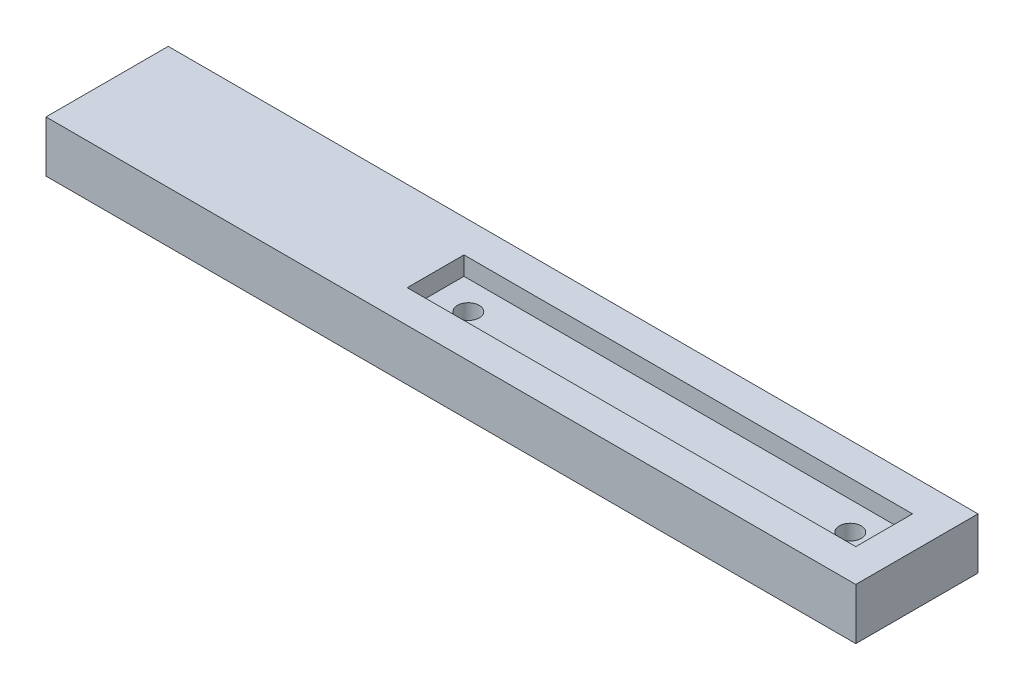
ISO-10303-21;
HEADER;
FILE_DESCRIPTION(('STEP AP214'),'2;1');
FILE_NAME('part.step','',(''),(''),'','','');
FILE_SCHEMA(('AUTOMOTIVE_DESIGN { 1 0 10303 214 1 1 1 1 }'));
ENDSEC;
DATA;
#1=APPLICATION_CONTEXT('core data for automotive mechanical design processes');
#2=APPLICATION_PROTOCOL_DEFINITION('international standard','automotive_design',2000,#1);
#3=PRODUCT_CONTEXT('',#1,'mechanical');
#4=PRODUCT('Part','Part','',(#3));
#5=PRODUCT_RELATED_PRODUCT_CATEGORY('part','',(#4));
#6=PRODUCT_DEFINITION_FORMATION('','',#4);
#7=PRODUCT_DEFINITION_CONTEXT('part definition',#1,'design');
#8=PRODUCT_DEFINITION('design','',#6,#7);
#9=PRODUCT_DEFINITION_SHAPE('','',#8);
#10=(LENGTH_UNIT() NAMED_UNIT(*) SI_UNIT(.MILLI.,.METRE.));
#11=(NAMED_UNIT(*) PLANE_ANGLE_UNIT() SI_UNIT($,.RADIAN.));
#12=(NAMED_UNIT(*) SI_UNIT($,.STERADIAN.) SOLID_ANGLE_UNIT());
#13=UNCERTAINTY_MEASURE_WITH_UNIT(LENGTH_MEASURE(1.E-05),#10,'distance_accuracy_value','');
#14=(GEOMETRIC_REPRESENTATION_CONTEXT(3) GLOBAL_UNCERTAINTY_ASSIGNED_CONTEXT((#13)) GLOBAL_UNIT_ASSIGNED_CONTEXT((#10,
#11,#12)) REPRESENTATION_CONTEXT('',''));
#15=CARTESIAN_POINT('',(0.,0.,0.));
#16=DIRECTION('',(0.,0.,1.));
#17=DIRECTION('',(1.,0.,0.));
#18=AXIS2_PLACEMENT_3D('',#15,#16,#17);
#19=CARTESIAN_POINT('',(-34.1,-1.7,2.6));
#20=DIRECTION('',(0.,0.,1.));
#21=DIRECTION('',(1.,0.,0.));
#22=AXIS2_PLACEMENT_3D('',#19,#20,#21);
#23=PLANE('',#22);
#24=DIRECTION('',(0.,-1.,0.));
#25=VECTOR('',#24,1.);
#26=CARTESIAN_POINT('',(-7.,27.5943834864996,2.6));
#27=LINE('',#26,#25);
#28=CARTESIAN_POINT('',(-7.,0.,2.6));
#29=VERTEX_POINT('',#28);
#30=CARTESIAN_POINT('',(-7.,-1.7,2.6));
#31=VERTEX_POINT('',#30);
#32=EDGE_CURVE('E65',#29,#31,#27,.T.);
#33=ORIENTED_EDGE('',*,*,#32,.F.);
#34=DIRECTION('',(1.,0.,0.));
#35=VECTOR('',#34,1.);
#36=CARTESIAN_POINT('',(-34.1,0.,2.6));
#37=LINE('',#36,#35);
#38=CARTESIAN_POINT('',(34.1,0.,2.6));
#39=VERTEX_POINT('',#38);
#40=EDGE_CURVE('E373',#29,#39,#37,.T.);
#41=ORIENTED_EDGE('',*,*,#40,.T.);
#42=DIRECTION('',(0.,1.,0.));
#43=VECTOR('',#42,1.);
#44=CARTESIAN_POINT('',(34.1,-1.7,2.6));
#45=LINE('',#44,#43);
#46=CARTESIAN_POINT('',(34.1,-1.7,2.6));
#47=VERTEX_POINT('',#46);
#48=EDGE_CURVE('E384',#47,#39,#45,.T.);
#49=ORIENTED_EDGE('',*,*,#48,.F.);
#50=DIRECTION('',(1.,0.,0.));
#51=VECTOR('',#50,1.);
#52=CARTESIAN_POINT('',(-34.1,-1.7,2.6));
#53=LINE('',#52,#51);
#54=EDGE_CURVE('E196',#31,#47,#53,.T.);
#55=ORIENTED_EDGE('',*,*,#54,.F.);
#56=EDGE_LOOP('',(#33,#41,#49,#55));
#57=FACE_BOUND('',#56,.T.);
#58=ADVANCED_FACE('F47',(#57),#23,.F.);
#59=CARTESIAN_POINT('',(-34.1,-1.7,-2.6));
#60=DIRECTION('',(0.,0.,-1.));
#61=DIRECTION('',(-1.,0.,0.));
#62=AXIS2_PLACEMENT_3D('',#59,#60,#61);
#63=PLANE('',#62);
#64=DIRECTION('',(0.,-1.,0.));
#65=VECTOR('',#64,1.);
#66=CARTESIAN_POINT('',(-7.,27.5943834864996,-2.6));
#67=LINE('',#66,#65);
#68=CARTESIAN_POINT('',(-7.,0.,-2.6));
#69=VERTEX_POINT('',#68);
#70=CARTESIAN_POINT('',(-7.,-1.7,-2.6));
#71=VERTEX_POINT('',#70);
#72=EDGE_CURVE('E198',#69,#71,#67,.T.);
#73=ORIENTED_EDGE('',*,*,#72,.T.);
#74=DIRECTION('',(-1.,0.,0.));
#75=VECTOR('',#74,1.);
#76=CARTESIAN_POINT('',(-34.1,-1.7,-2.6));
#77=LINE('',#76,#75);
#78=CARTESIAN_POINT('',(34.1,-1.7,-2.6));
#79=VERTEX_POINT('',#78);
#80=EDGE_CURVE('E189',#79,#71,#77,.T.);
#81=ORIENTED_EDGE('',*,*,#80,.F.);
#82=DIRECTION('',(0.,1.,0.));
#83=VECTOR('',#82,1.);
#84=CARTESIAN_POINT('',(34.1,-1.7,-2.6));
#85=LINE('',#84,#83);
#86=CARTESIAN_POINT('',(34.1,0.,-2.6));
#87=VERTEX_POINT('',#86);
#88=EDGE_CURVE('E377',#79,#87,#85,.T.);
#89=ORIENTED_EDGE('',*,*,#88,.T.);
#90=DIRECTION('',(-1.,0.,0.));
#91=VECTOR('',#90,1.);
#92=CARTESIAN_POINT('',(-34.1,0.,-2.6));
#93=LINE('',#92,#91);
#94=EDGE_CURVE('E73',#87,#69,#93,.T.);
#95=ORIENTED_EDGE('',*,*,#94,.T.);
#96=EDGE_LOOP('',(#73,#81,#89,#95));
#97=FACE_BOUND('',#96,.T.);
#98=ADVANCED_FACE('F199',(#97),#63,.F.);
#99=CARTESIAN_POINT('',(0.,-1.7,0.));
#100=DIRECTION('',(0.,-1.,0.));
#101=DIRECTION('',(0.,0.,-1.));
#102=AXIS2_PLACEMENT_3D('',#99,#100,#101);
#103=PLANE('',#102);
#104=CARTESIAN_POINT('',(31.,-1.7,0.));
#105=DIRECTION('',(0.,1.,0.));
#106=DIRECTION('',(0.,0.,1.));
#107=AXIS2_PLACEMENT_3D('',#104,#105,#106);
#108=CIRCLE('',#107,0.999999999999995);
#109=CARTESIAN_POINT('',(31.,-1.7,0.999999999999995));
#110=VERTEX_POINT('',#109);
#111=EDGE_CURVE('E352',#110,#110,#108,.T.);
#112=ORIENTED_EDGE('',*,*,#111,.F.);
#113=EDGE_LOOP('',(#112));
#114=FACE_BOUND('',#113,.T.);
#115=CARTESIAN_POINT('',(-4.,-1.7,0.));
#116=DIRECTION('',(0.,1.,0.));
#117=DIRECTION('',(0.,0.,1.));
#118=AXIS2_PLACEMENT_3D('',#115,#116,#117);
#119=CIRCLE('',#118,1.);
#120=CARTESIAN_POINT('',(-4.,-1.7,1.));
#121=VERTEX_POINT('',#120);
#122=EDGE_CURVE('E347',#121,#121,#119,.T.);
#123=ORIENTED_EDGE('',*,*,#122,.F.);
#124=EDGE_LOOP('',(#123));
#125=FACE_BOUND('',#124,.T.);
#126=DIRECTION('',(0.,0.,-1.));
#127=VECTOR('',#126,1.);
#128=CARTESIAN_POINT('',(-7.,-1.7,-2.6));
#129=LINE('',#128,#127);
#130=EDGE_CURVE('E192',#31,#71,#129,.T.);
#131=ORIENTED_EDGE('',*,*,#130,.F.);
#132=ORIENTED_EDGE('',*,*,#54,.T.);
#133=DIRECTION('',(0.,0.,-1.));
#134=VECTOR('',#133,1.);
#135=CARTESIAN_POINT('',(34.1,-1.7,-2.6));
#136=LINE('',#135,#134);
#137=EDGE_CURVE('E194',#47,#79,#136,.T.);
#138=ORIENTED_EDGE('',*,*,#137,.T.);
#139=ORIENTED_EDGE('',*,*,#80,.T.);
#140=EDGE_LOOP('',(#131,#132,#138,#139));
#141=FACE_BOUND('',#140,.T.);
#142=ADVANCED_FACE('F190',(#114,#125,#141),#103,.F.);
#143=CARTESIAN_POINT('',(31.,-7.5284271247462,0.));
#144=DIRECTION('',(0.,1.,0.));
#145=DIRECTION('',(0.,0.,1.));
#146=AXIS2_PLACEMENT_3D('',#143,#144,#145);
#147=CYLINDRICAL_SURFACE('',#146,0.999999999999995);
#148=ORIENTED_EDGE('',*,*,#111,.T.);
#149=EDGE_LOOP('',(#148));
#150=FACE_BOUND('',#149,.T.);
#151=CARTESIAN_POINT('',(31.,-3.1,0.));
#152=DIRECTION('',(0.,-1.,0.));
#153=DIRECTION('',(0.,0.,-1.));
#154=AXIS2_PLACEMENT_3D('',#151,#152,#153);
#155=CIRCLE('',#154,0.999999999999995);
#156=CARTESIAN_POINT('',(31.,-3.1,-0.999999999999995));
#157=VERTEX_POINT('',#156);
#158=EDGE_CURVE('E51',#157,#157,#155,.F.);
#159=ORIENTED_EDGE('',*,*,#158,.F.);
#160=EDGE_LOOP('',(#159));
#161=FACE_BOUND('',#160,.T.);
#162=ADVANCED_FACE('F423',(#150,#161),#147,.F.);
#163=CARTESIAN_POINT('',(-4.,-7.5284271247462,0.));
#164=DIRECTION('',(0.,1.,0.));
#165=DIRECTION('',(0.,0.,1.));
#166=AXIS2_PLACEMENT_3D('',#163,#164,#165);
#167=CYLINDRICAL_SURFACE('',#166,1.);
#168=ORIENTED_EDGE('',*,*,#122,.T.);
#169=EDGE_LOOP('',(#168));
#170=FACE_BOUND('',#169,.T.);
#171=CARTESIAN_POINT('',(-4.,-3.1,0.));
#172=DIRECTION('',(0.,-1.,0.));
#173=DIRECTION('',(0.,0.,-1.));
#174=AXIS2_PLACEMENT_3D('',#171,#172,#173);
#175=CIRCLE('',#174,1.);
#176=CARTESIAN_POINT('',(-4.,-3.1,-1.));
#177=VERTEX_POINT('',#176);
#178=EDGE_CURVE('E267',#177,#177,#175,.F.);
#179=ORIENTED_EDGE('',*,*,#178,.F.);
#180=EDGE_LOOP('',(#179));
#181=FACE_BOUND('',#180,.T.);
#182=ADVANCED_FACE('F425',(#170,#181),#167,.F.);
#183=CARTESIAN_POINT('',(-37.1,-1.7,-5.6));
#184=DIRECTION('',(-1.,0.,0.));
#185=DIRECTION('',(0.,0.,1.));
#186=AXIS2_PLACEMENT_3D('',#183,#184,#185);
#187=PLANE('',#186);
#188=DIRECTION('',(0.,0.,1.));
#189=VECTOR('',#188,1.);
#190=CARTESIAN_POINT('',(-37.1,0.,-5.6));
#191=LINE('',#190,#189);
#192=CARTESIAN_POINT('',(-37.1,0.,-5.6));
#193=VERTEX_POINT('',#192);
#194=CARTESIAN_POINT('',(-37.1,0.,5.6));
#195=VERTEX_POINT('',#194);
#196=EDGE_CURVE('E388',#193,#195,#191,.T.);
#197=ORIENTED_EDGE('',*,*,#196,.F.);
#198=DIRECTION('',(0.,1.,0.));
#199=VECTOR('',#198,1.);
#200=CARTESIAN_POINT('',(-37.1,-1.7,-5.6));
#201=LINE('',#200,#199);
#202=CARTESIAN_POINT('',(-37.1,-4.7,-5.6));
#203=VERTEX_POINT('',#202);
#204=EDGE_CURVE('E11',#203,#193,#201,.T.);
#205=ORIENTED_EDGE('',*,*,#204,.F.);
#206=DIRECTION('',(0.,0.,-1.));
#207=VECTOR('',#206,1.);
#208=CARTESIAN_POINT('',(-37.1,-4.7,5.6));
#209=LINE('',#208,#207);
#210=CARTESIAN_POINT('',(-37.1,-4.7,5.6));
#211=VERTEX_POINT('',#210);
#212=EDGE_CURVE('E359',#211,#203,#209,.T.);
#213=ORIENTED_EDGE('',*,*,#212,.F.);
#214=DIRECTION('',(0.,1.,0.));
#215=VECTOR('',#214,1.);
#216=CARTESIAN_POINT('',(-37.1,-1.7,5.6));
#217=LINE('',#216,#215);
#218=EDGE_CURVE('E405',#211,#195,#217,.T.);
#219=ORIENTED_EDGE('',*,*,#218,.T.);
#220=EDGE_LOOP('',(#197,#205,#213,#219));
#221=FACE_BOUND('',#220,.T.);
#222=ADVANCED_FACE('F49',(#221),#187,.T.);
#223=CARTESIAN_POINT('',(-37.1,-1.7,-5.6));
#224=DIRECTION('',(0.,0.,-1.));
#225=DIRECTION('',(-1.,0.,0.));
#226=AXIS2_PLACEMENT_3D('',#223,#224,#225);
#227=PLANE('',#226);
#228=DIRECTION('',(-1.,0.,0.));
#229=VECTOR('',#228,1.);
#230=CARTESIAN_POINT('',(-37.1,0.,-5.6));
#231=LINE('',#230,#229);
#232=CARTESIAN_POINT('',(37.1,0.,-5.6));
#233=VERTEX_POINT('',#232);
#234=EDGE_CURVE('E402',#233,#193,#231,.T.);
#235=ORIENTED_EDGE('',*,*,#234,.F.);
#236=DIRECTION('',(0.,1.,0.));
#237=VECTOR('',#236,1.);
#238=CARTESIAN_POINT('',(37.1,-1.7,-5.6));
#239=LINE('',#238,#237);
#240=CARTESIAN_POINT('',(37.1,-4.7,-5.6));
#241=VERTEX_POINT('',#240);
#242=EDGE_CURVE('E57',#241,#233,#239,.T.);
#243=ORIENTED_EDGE('',*,*,#242,.F.);
#244=DIRECTION('',(1.,0.,0.));
#245=VECTOR('',#244,1.);
#246=CARTESIAN_POINT('',(-37.1,-4.7,-5.6));
#247=LINE('',#246,#245);
#248=EDGE_CURVE('E363',#203,#241,#247,.T.);
#249=ORIENTED_EDGE('',*,*,#248,.F.);
#250=ORIENTED_EDGE('',*,*,#204,.T.);
#251=EDGE_LOOP('',(#235,#243,#249,#250));
#252=FACE_BOUND('',#251,.T.);
#253=ADVANCED_FACE('F455',(#252),#227,.T.);
#254=CARTESIAN_POINT('',(37.1,-1.7,-5.6));
#255=DIRECTION('',(1.,0.,0.));
#256=DIRECTION('',(0.,0.,-1.));
#257=AXIS2_PLACEMENT_3D('',#254,#255,#256);
#258=PLANE('',#257);
#259=DIRECTION('',(0.,0.,-1.));
#260=VECTOR('',#259,1.);
#261=CARTESIAN_POINT('',(37.1,0.,-5.6));
#262=LINE('',#261,#260);
#263=CARTESIAN_POINT('',(37.1,0.,5.6));
#264=VERTEX_POINT('',#263);
#265=EDGE_CURVE('E398',#264,#233,#262,.T.);
#266=ORIENTED_EDGE('',*,*,#265,.F.);
#267=DIRECTION('',(0.,1.,0.));
#268=VECTOR('',#267,1.);
#269=CARTESIAN_POINT('',(37.1,-1.7,5.6));
#270=LINE('',#269,#268);
#271=CARTESIAN_POINT('',(37.1,-4.7,5.6));
#272=VERTEX_POINT('',#271);
#273=EDGE_CURVE('E409',#272,#264,#270,.T.);
#274=ORIENTED_EDGE('',*,*,#273,.F.);
#275=DIRECTION('',(0.,0.,1.));
#276=VECTOR('',#275,1.);
#277=CARTESIAN_POINT('',(37.1,-4.7,-5.6));
#278=LINE('',#277,#276);
#279=EDGE_CURVE('E367',#241,#272,#278,.T.);
#280=ORIENTED_EDGE('',*,*,#279,.F.);
#281=ORIENTED_EDGE('',*,*,#242,.T.);
#282=EDGE_LOOP('',(#266,#274,#280,#281));
#283=FACE_BOUND('',#282,.T.);
#284=ADVANCED_FACE('F458',(#283),#258,.T.);
#285=CARTESIAN_POINT('',(-37.1,-1.7,5.6));
#286=DIRECTION('',(0.,0.,1.));
#287=DIRECTION('',(1.,0.,0.));
#288=AXIS2_PLACEMENT_3D('',#285,#286,#287);
#289=PLANE('',#288);
#290=DIRECTION('',(1.,0.,0.));
#291=VECTOR('',#290,1.);
#292=CARTESIAN_POINT('',(-37.1,0.,5.6));
#293=LINE('',#292,#291);
#294=EDGE_CURVE('E394',#195,#264,#293,.T.);
#295=ORIENTED_EDGE('',*,*,#294,.F.);
#296=ORIENTED_EDGE('',*,*,#218,.F.);
#297=DIRECTION('',(-1.,0.,0.));
#298=VECTOR('',#297,1.);
#299=CARTESIAN_POINT('',(37.1,-4.7,5.6));
#300=LINE('',#299,#298);
#301=EDGE_CURVE('E351',#272,#211,#300,.T.);
#302=ORIENTED_EDGE('',*,*,#301,.F.);
#303=ORIENTED_EDGE('',*,*,#273,.T.);
#304=EDGE_LOOP('',(#295,#296,#302,#303));
#305=FACE_BOUND('',#304,.T.);
#306=ADVANCED_FACE('F453',(#305),#289,.T.);
#307=CARTESIAN_POINT('',(0.,0.,0.));
#308=DIRECTION('',(0.,1.,0.));
#309=DIRECTION('',(0.,0.,1.));
#310=AXIS2_PLACEMENT_3D('',#307,#308,#309);
#311=PLANE('',#310);
#312=ORIENTED_EDGE('',*,*,#40,.F.);
#313=DIRECTION('',(0.,0.,-1.));
#314=VECTOR('',#313,1.);
#315=CARTESIAN_POINT('',(-7.,0.,-2.6));
#316=LINE('',#315,#314);
#317=EDGE_CURVE('E207',#29,#69,#316,.T.);
#318=ORIENTED_EDGE('',*,*,#317,.T.);
#319=ORIENTED_EDGE('',*,*,#94,.F.);
#320=DIRECTION('',(0.,0.,-1.));
#321=VECTOR('',#320,1.);
#322=CARTESIAN_POINT('',(34.1,0.,-2.6));
#323=LINE('',#322,#321);
#324=EDGE_CURVE('E371',#39,#87,#323,.T.);
#325=ORIENTED_EDGE('',*,*,#324,.F.);
#326=EDGE_LOOP('',(#312,#318,#319,#325));
#327=FACE_BOUND('',#326,.T.);
#328=ORIENTED_EDGE('',*,*,#196,.T.);
#329=ORIENTED_EDGE('',*,*,#294,.T.);
#330=ORIENTED_EDGE('',*,*,#265,.T.);
#331=ORIENTED_EDGE('',*,*,#234,.T.);
#332=EDGE_LOOP('',(#328,#329,#330,#331));
#333=FACE_BOUND('',#332,.T.);
#334=ADVANCED_FACE('F449',(#327,#333),#311,.T.);
#335=CARTESIAN_POINT('',(34.1,-1.7,-2.6));
#336=DIRECTION('',(1.,0.,0.));
#337=DIRECTION('',(0.,0.,-1.));
#338=AXIS2_PLACEMENT_3D('',#335,#336,#337);
#339=PLANE('',#338);
#340=ORIENTED_EDGE('',*,*,#324,.T.);
#341=ORIENTED_EDGE('',*,*,#88,.F.);
#342=ORIENTED_EDGE('',*,*,#137,.F.);
#343=ORIENTED_EDGE('',*,*,#48,.T.);
#344=EDGE_LOOP('',(#340,#341,#342,#343));
#345=FACE_BOUND('',#344,.T.);
#346=ADVANCED_FACE('F446',(#345),#339,.F.);
#347=CARTESIAN_POINT('',(0.,-4.7,0.));
#348=DIRECTION('',(0.,-1.,0.));
#349=DIRECTION('',(0.,0.,-1.));
#350=AXIS2_PLACEMENT_3D('',#347,#348,#349);
#351=PLANE('',#350);
#352=DIRECTION('',(0.5,0.,-0.866025403784439));
#353=VECTOR('',#352,1.);
#354=CARTESIAN_POINT('',(-6.3,-4.7,0.));
#355=LINE('',#354,#353);
#356=CARTESIAN_POINT('',(-6.3,-4.7,0.));
#357=VERTEX_POINT('',#356);
#358=CARTESIAN_POINT('',(-5.15,-4.7,-1.99185842870421));
#359=VERTEX_POINT('',#358);
#360=EDGE_CURVE('E241',#357,#359,#355,.T.);
#361=ORIENTED_EDGE('',*,*,#360,.F.);
#362=DIRECTION('',(-0.499999999999999,0.,-0.866025403784439));
#363=VECTOR('',#362,1.);
#364=CARTESIAN_POINT('',(-5.15,-4.7,1.99185842870421));
#365=LINE('',#364,#363);
#366=CARTESIAN_POINT('',(-5.15,-4.7,1.99185842870421));
#367=VERTEX_POINT('',#366);
#368=EDGE_CURVE('E220',#367,#357,#365,.T.);
#369=ORIENTED_EDGE('',*,*,#368,.F.);
#370=DIRECTION('',(-1.,0.,0.));
#371=VECTOR('',#370,1.);
#372=CARTESIAN_POINT('',(-2.85,-4.7,1.99185842870421));
#373=LINE('',#372,#371);
#374=CARTESIAN_POINT('',(-2.85,-4.7,1.99185842870421));
#375=VERTEX_POINT('',#374);
#376=EDGE_CURVE('E257',#375,#367,#373,.T.);
#377=ORIENTED_EDGE('',*,*,#376,.F.);
#378=DIRECTION('',(-0.5,0.,0.866025403784438));
#379=VECTOR('',#378,1.);
#380=CARTESIAN_POINT('',(-1.7,-4.7,0.));
#381=LINE('',#380,#379);
#382=CARTESIAN_POINT('',(-1.7,-4.7,0.));
#383=VERTEX_POINT('',#382);
#384=EDGE_CURVE('E253',#383,#375,#381,.T.);
#385=ORIENTED_EDGE('',*,*,#384,.F.);
#386=DIRECTION('',(0.5,0.,0.866025403784439));
#387=VECTOR('',#386,1.);
#388=CARTESIAN_POINT('',(-2.85,-4.7,-1.99185842870421));
#389=LINE('',#388,#387);
#390=CARTESIAN_POINT('',(-2.85,-4.7,-1.99185842870421));
#391=VERTEX_POINT('',#390);
#392=EDGE_CURVE('E249',#391,#383,#389,.T.);
#393=ORIENTED_EDGE('',*,*,#392,.F.);
#394=DIRECTION('',(1.,0.,0.));
#395=VECTOR('',#394,1.);
#396=CARTESIAN_POINT('',(-5.15,-4.7,-1.99185842870421));
#397=LINE('',#396,#395);
#398=EDGE_CURVE('E244',#359,#391,#397,.T.);
#399=ORIENTED_EDGE('',*,*,#398,.F.);
#400=EDGE_LOOP('',(#361,#369,#377,#385,#393,#399));
#401=FACE_BOUND('',#400,.T.);
#402=DIRECTION('',(0.5,0.,0.866025403784439));
#403=VECTOR('',#402,1.);
#404=CARTESIAN_POINT('',(32.15,-4.7,-1.99185842870421));
#405=LINE('',#404,#403);
#406=CARTESIAN_POINT('',(32.15,-4.7,-1.99185842870421));
#407=VERTEX_POINT('',#406);
#408=CARTESIAN_POINT('',(33.3,-4.7,0.));
#409=VERTEX_POINT('',#408);
#410=EDGE_CURVE('E245',#407,#409,#405,.T.);
#411=ORIENTED_EDGE('',*,*,#410,.F.);
#412=DIRECTION('',(1.,0.,0.));
#413=VECTOR('',#412,1.);
#414=CARTESIAN_POINT('',(29.85,-4.7,-1.99185842870421));
#415=LINE('',#414,#413);
#416=CARTESIAN_POINT('',(29.85,-4.7,-1.99185842870421));
#417=VERTEX_POINT('',#416);
#418=EDGE_CURVE('E302',#417,#407,#415,.T.);
#419=ORIENTED_EDGE('',*,*,#418,.F.);
#420=DIRECTION('',(0.500000000000001,0.,-0.866025403784438));
#421=VECTOR('',#420,1.);
#422=CARTESIAN_POINT('',(28.7,-4.7,0.));
#423=LINE('',#422,#421);
#424=CARTESIAN_POINT('',(28.7,-4.7,0.));
#425=VERTEX_POINT('',#424);
#426=EDGE_CURVE('E306',#425,#417,#423,.T.);
#427=ORIENTED_EDGE('',*,*,#426,.F.);
#428=DIRECTION('',(-0.5,0.,-0.866025403784438));
#429=VECTOR('',#428,1.);
#430=CARTESIAN_POINT('',(29.85,-4.7,1.99185842870421));
#431=LINE('',#430,#429);
#432=CARTESIAN_POINT('',(29.85,-4.7,1.99185842870421));
#433=VERTEX_POINT('',#432);
#434=EDGE_CURVE('E311',#433,#425,#431,.T.);
#435=ORIENTED_EDGE('',*,*,#434,.F.);
#436=DIRECTION('',(-1.,0.,0.));
#437=VECTOR('',#436,1.);
#438=CARTESIAN_POINT('',(32.15,-4.7,1.99185842870421));
#439=LINE('',#438,#437);
#440=CARTESIAN_POINT('',(32.15,-4.7,1.99185842870421));
#441=VERTEX_POINT('',#440);
#442=EDGE_CURVE('E315',#441,#433,#439,.T.);
#443=ORIENTED_EDGE('',*,*,#442,.F.);
#444=DIRECTION('',(-0.499999999999999,0.,0.866025403784439));
#445=VECTOR('',#444,1.);
#446=CARTESIAN_POINT('',(33.3,-4.7,0.));
#447=LINE('',#446,#445);
#448=EDGE_CURVE('E319',#409,#441,#447,.T.);
#449=ORIENTED_EDGE('',*,*,#448,.F.);
#450=EDGE_LOOP('',(#411,#419,#427,#435,#443,#449));
#451=FACE_BOUND('',#450,.T.);
#452=ORIENTED_EDGE('',*,*,#301,.T.);
#453=ORIENTED_EDGE('',*,*,#212,.T.);
#454=ORIENTED_EDGE('',*,*,#248,.T.);
#455=ORIENTED_EDGE('',*,*,#279,.T.);
#456=EDGE_LOOP('',(#452,#453,#454,#455));
#457=FACE_BOUND('',#456,.T.);
#458=ADVANCED_FACE('F448',(#401,#451,#457),#351,.T.);
#459=CARTESIAN_POINT('',(0.,-3.1,0.));
#460=DIRECTION('',(0.,-1.,0.));
#461=DIRECTION('',(0.,0.,-1.));
#462=AXIS2_PLACEMENT_3D('',#459,#460,#461);
#463=PLANE('',#462);
#464=DIRECTION('',(0.5,0.,-0.866025403784439));
#465=VECTOR('',#464,1.);
#466=CARTESIAN_POINT('',(-6.3,-3.1,0.));
#467=LINE('',#466,#465);
#468=CARTESIAN_POINT('',(-6.3,-3.1,0.));
#469=VERTEX_POINT('',#468);
#470=CARTESIAN_POINT('',(-5.15,-3.1,-1.99185842870421));
#471=VERTEX_POINT('',#470);
#472=EDGE_CURVE('E215',#469,#471,#467,.T.);
#473=ORIENTED_EDGE('',*,*,#472,.T.);
#474=DIRECTION('',(1.,0.,0.));
#475=VECTOR('',#474,1.);
#476=CARTESIAN_POINT('',(-5.15,-3.1,-1.99185842870421));
#477=LINE('',#476,#475);
#478=CARTESIAN_POINT('',(-2.85,-3.1,-1.99185842870421));
#479=VERTEX_POINT('',#478);
#480=EDGE_CURVE('E219',#471,#479,#477,.T.);
#481=ORIENTED_EDGE('',*,*,#480,.T.);
#482=DIRECTION('',(0.5,0.,0.866025403784439));
#483=VECTOR('',#482,1.);
#484=CARTESIAN_POINT('',(-2.85,-3.1,-1.99185842870421));
#485=LINE('',#484,#483);
#486=CARTESIAN_POINT('',(-1.7,-3.1,0.));
#487=VERTEX_POINT('',#486);
#488=EDGE_CURVE('E224',#479,#487,#485,.T.);
#489=ORIENTED_EDGE('',*,*,#488,.T.);
#490=DIRECTION('',(-0.5,0.,0.866025403784438));
#491=VECTOR('',#490,1.);
#492=CARTESIAN_POINT('',(-1.7,-3.1,0.));
#493=LINE('',#492,#491);
#494=CARTESIAN_POINT('',(-2.85,-3.1,1.99185842870421));
#495=VERTEX_POINT('',#494);
#496=EDGE_CURVE('E228',#487,#495,#493,.T.);
#497=ORIENTED_EDGE('',*,*,#496,.T.);
#498=DIRECTION('',(-1.,0.,0.));
#499=VECTOR('',#498,1.);
#500=CARTESIAN_POINT('',(-2.85,-3.1,1.99185842870421));
#501=LINE('',#500,#499);
#502=CARTESIAN_POINT('',(-5.15,-3.1,1.99185842870421));
#503=VERTEX_POINT('',#502);
#504=EDGE_CURVE('E232',#495,#503,#501,.T.);
#505=ORIENTED_EDGE('',*,*,#504,.T.);
#506=DIRECTION('',(-0.499999999999999,0.,-0.866025403784439));
#507=VECTOR('',#506,1.);
#508=CARTESIAN_POINT('',(-5.15,-3.1,1.99185842870421));
#509=LINE('',#508,#507);
#510=EDGE_CURVE('E236',#503,#469,#509,.T.);
#511=ORIENTED_EDGE('',*,*,#510,.T.);
#512=EDGE_LOOP('',(#473,#481,#489,#497,#505,#511));
#513=FACE_BOUND('',#512,.T.);
#514=ORIENTED_EDGE('',*,*,#178,.T.);
#515=EDGE_LOOP('',(#514));
#516=FACE_BOUND('',#515,.T.);
#517=ADVANCED_FACE('F478',(#513,#516),#463,.T.);
#518=CARTESIAN_POINT('',(-6.3,-3.1,0.));
#519=DIRECTION('',(-0.866025403784439,0.,-0.5));
#520=DIRECTION('',(-0.5,0.,0.866025403784439));
#521=AXIS2_PLACEMENT_3D('',#518,#519,#520);
#522=PLANE('',#521);
#523=ORIENTED_EDGE('',*,*,#360,.T.);
#524=DIRECTION('',(0.,-1.,0.));
#525=VECTOR('',#524,1.);
#526=CARTESIAN_POINT('',(-5.15,-3.1,-1.99185842870421));
#527=LINE('',#526,#525);
#528=EDGE_CURVE('E240',#471,#359,#527,.T.);
#529=ORIENTED_EDGE('',*,*,#528,.F.);
#530=ORIENTED_EDGE('',*,*,#472,.F.);
#531=DIRECTION('',(0.,-1.,0.));
#532=VECTOR('',#531,1.);
#533=CARTESIAN_POINT('',(-6.3,-3.1,0.));
#534=LINE('',#533,#532);
#535=EDGE_CURVE('E264',#469,#357,#534,.T.);
#536=ORIENTED_EDGE('',*,*,#535,.T.);
#537=EDGE_LOOP('',(#523,#529,#530,#536));
#538=FACE_BOUND('',#537,.T.);
#539=ADVANCED_FACE('F483',(#538),#522,.F.);
#540=CARTESIAN_POINT('',(-5.15,-3.1,1.99185842870421));
#541=DIRECTION('',(-0.866025403784439,0.,0.5));
#542=DIRECTION('',(0.5,0.,0.866025403784439));
#543=AXIS2_PLACEMENT_3D('',#540,#541,#542);
#544=PLANE('',#543);
#545=ORIENTED_EDGE('',*,*,#368,.T.);
#546=ORIENTED_EDGE('',*,*,#535,.F.);
#547=ORIENTED_EDGE('',*,*,#510,.F.);
#548=DIRECTION('',(0.,-1.,0.));
#549=VECTOR('',#548,1.);
#550=CARTESIAN_POINT('',(-5.15,-3.1,1.99185842870421));
#551=LINE('',#550,#549);
#552=EDGE_CURVE('E268',#503,#367,#551,.T.);
#553=ORIENTED_EDGE('',*,*,#552,.T.);
#554=EDGE_LOOP('',(#545,#546,#547,#553));
#555=FACE_BOUND('',#554,.T.);
#556=ADVANCED_FACE('F546',(#555),#544,.F.);
#557=CARTESIAN_POINT('',(-2.85,-3.1,1.99185842870421));
#558=DIRECTION('',(0.,0.,1.));
#559=DIRECTION('',(1.,0.,0.));
#560=AXIS2_PLACEMENT_3D('',#557,#558,#559);
#561=PLANE('',#560);
#562=ORIENTED_EDGE('',*,*,#376,.T.);
#563=ORIENTED_EDGE('',*,*,#552,.F.);
#564=ORIENTED_EDGE('',*,*,#504,.F.);
#565=DIRECTION('',(0.,-1.,0.));
#566=VECTOR('',#565,1.);
#567=CARTESIAN_POINT('',(-2.85,-3.1,1.99185842870421));
#568=LINE('',#567,#566);
#569=EDGE_CURVE('E271',#495,#375,#568,.T.);
#570=ORIENTED_EDGE('',*,*,#569,.T.);
#571=EDGE_LOOP('',(#562,#563,#564,#570));
#572=FACE_BOUND('',#571,.T.);
#573=ADVANCED_FACE('F551',(#572),#561,.F.);
#574=CARTESIAN_POINT('',(-1.7,-3.1,0.));
#575=DIRECTION('',(0.866025403784438,0.,0.5));
#576=DIRECTION('',(0.5,0.,-0.866025403784439));
#577=AXIS2_PLACEMENT_3D('',#574,#575,#576);
#578=PLANE('',#577);
#579=ORIENTED_EDGE('',*,*,#384,.T.);
#580=ORIENTED_EDGE('',*,*,#569,.F.);
#581=ORIENTED_EDGE('',*,*,#496,.F.);
#582=DIRECTION('',(0.,-1.,0.));
#583=VECTOR('',#582,1.);
#584=CARTESIAN_POINT('',(-1.7,-3.1,0.));
#585=LINE('',#584,#583);
#586=EDGE_CURVE('E274',#487,#383,#585,.T.);
#587=ORIENTED_EDGE('',*,*,#586,.T.);
#588=EDGE_LOOP('',(#579,#580,#581,#587));
#589=FACE_BOUND('',#588,.T.);
#590=ADVANCED_FACE('F540',(#589),#578,.F.);
#591=CARTESIAN_POINT('',(-2.85,-3.1,-1.99185842870421));
#592=DIRECTION('',(0.866025403784438,0.,-0.5));
#593=DIRECTION('',(-0.5,0.,-0.866025403784439));
#594=AXIS2_PLACEMENT_3D('',#591,#592,#593);
#595=PLANE('',#594);
#596=ORIENTED_EDGE('',*,*,#392,.T.);
#597=ORIENTED_EDGE('',*,*,#586,.F.);
#598=ORIENTED_EDGE('',*,*,#488,.F.);
#599=DIRECTION('',(0.,-1.,0.));
#600=VECTOR('',#599,1.);
#601=CARTESIAN_POINT('',(-2.85,-3.1,-1.99185842870421));
#602=LINE('',#601,#600);
#603=EDGE_CURVE('E277',#479,#391,#602,.T.);
#604=ORIENTED_EDGE('',*,*,#603,.T.);
#605=EDGE_LOOP('',(#596,#597,#598,#604));
#606=FACE_BOUND('',#605,.T.);
#607=ADVANCED_FACE('F534',(#606),#595,.F.);
#608=CARTESIAN_POINT('',(-5.15,-3.1,-1.99185842870421));
#609=DIRECTION('',(0.,0.,-1.));
#610=DIRECTION('',(-1.,0.,0.));
#611=AXIS2_PLACEMENT_3D('',#608,#609,#610);
#612=PLANE('',#611);
#613=ORIENTED_EDGE('',*,*,#398,.T.);
#614=ORIENTED_EDGE('',*,*,#603,.F.);
#615=ORIENTED_EDGE('',*,*,#480,.F.);
#616=ORIENTED_EDGE('',*,*,#528,.T.);
#617=EDGE_LOOP('',(#613,#614,#615,#616));
#618=FACE_BOUND('',#617,.T.);
#619=ADVANCED_FACE('F529',(#618),#612,.F.);
#620=CARTESIAN_POINT('',(0.,-3.1,0.));
#621=DIRECTION('',(0.,-1.,0.));
#622=DIRECTION('',(0.,0.,-1.));
#623=AXIS2_PLACEMENT_3D('',#620,#621,#622);
#624=PLANE('',#623);
#625=DIRECTION('',(0.5,0.,0.866025403784439));
#626=VECTOR('',#625,1.);
#627=CARTESIAN_POINT('',(32.15,-3.1,-1.99185842870421));
#628=LINE('',#627,#626);
#629=CARTESIAN_POINT('',(32.15,-3.1,-1.99185842870421));
#630=VERTEX_POINT('',#629);
#631=CARTESIAN_POINT('',(33.3,-3.1,0.));
#632=VERTEX_POINT('',#631);
#633=EDGE_CURVE('E307',#630,#632,#628,.T.);
#634=ORIENTED_EDGE('',*,*,#633,.T.);
#635=DIRECTION('',(-0.499999999999999,0.,0.866025403784439));
#636=VECTOR('',#635,1.);
#637=CARTESIAN_POINT('',(33.3,-3.1,0.));
#638=LINE('',#637,#636);
#639=CARTESIAN_POINT('',(32.15,-3.1,1.99185842870421));
#640=VERTEX_POINT('',#639);
#641=EDGE_CURVE('E340',#632,#640,#638,.T.);
#642=ORIENTED_EDGE('',*,*,#641,.T.);
#643=DIRECTION('',(-1.,0.,0.));
#644=VECTOR('',#643,1.);
#645=CARTESIAN_POINT('',(32.15,-3.1,1.99185842870421));
#646=LINE('',#645,#644);
#647=CARTESIAN_POINT('',(29.85,-3.1,1.99185842870421));
#648=VERTEX_POINT('',#647);
#649=EDGE_CURVE('E336',#640,#648,#646,.T.);
#650=ORIENTED_EDGE('',*,*,#649,.T.);
#651=DIRECTION('',(-0.5,0.,-0.866025403784438));
#652=VECTOR('',#651,1.);
#653=CARTESIAN_POINT('',(29.85,-3.1,1.99185842870421));
#654=LINE('',#653,#652);
#655=CARTESIAN_POINT('',(28.7,-3.1,0.));
#656=VERTEX_POINT('',#655);
#657=EDGE_CURVE('E332',#648,#656,#654,.T.);
#658=ORIENTED_EDGE('',*,*,#657,.T.);
#659=DIRECTION('',(0.500000000000001,0.,-0.866025403784438));
#660=VECTOR('',#659,1.);
#661=CARTESIAN_POINT('',(28.7,-3.1,0.));
#662=LINE('',#661,#660);
#663=CARTESIAN_POINT('',(29.85,-3.1,-1.99185842870421));
#664=VERTEX_POINT('',#663);
#665=EDGE_CURVE('E328',#656,#664,#662,.T.);
#666=ORIENTED_EDGE('',*,*,#665,.T.);
#667=DIRECTION('',(1.,0.,0.));
#668=VECTOR('',#667,1.);
#669=CARTESIAN_POINT('',(29.85,-3.1,-1.99185842870421));
#670=LINE('',#669,#668);
#671=EDGE_CURVE('E287',#664,#630,#670,.T.);
#672=ORIENTED_EDGE('',*,*,#671,.T.);
#673=EDGE_LOOP('',(#634,#642,#650,#658,#666,#672));
#674=FACE_BOUND('',#673,.T.);
#675=ORIENTED_EDGE('',*,*,#158,.T.);
#676=EDGE_LOOP('',(#675));
#677=FACE_BOUND('',#676,.T.);
#678=ADVANCED_FACE('F421',(#674,#677),#624,.T.);
#679=CARTESIAN_POINT('',(32.15,-3.1,-1.99185842870421));
#680=DIRECTION('',(0.866025403784439,0.,-0.5));
#681=DIRECTION('',(-0.5,0.,-0.866025403784439));
#682=AXIS2_PLACEMENT_3D('',#679,#680,#681);
#683=PLANE('',#682);
#684=ORIENTED_EDGE('',*,*,#410,.T.);
#685=DIRECTION('',(0.,-1.,0.));
#686=VECTOR('',#685,1.);
#687=CARTESIAN_POINT('',(33.3,-3.1,0.));
#688=LINE('',#687,#686);
#689=EDGE_CURVE('E283',#632,#409,#688,.T.);
#690=ORIENTED_EDGE('',*,*,#689,.F.);
#691=ORIENTED_EDGE('',*,*,#633,.F.);
#692=DIRECTION('',(0.,-1.,0.));
#693=VECTOR('',#692,1.);
#694=CARTESIAN_POINT('',(32.15,-3.1,-1.99185842870421));
#695=LINE('',#694,#693);
#696=EDGE_CURVE('E211',#630,#407,#695,.T.);
#697=ORIENTED_EDGE('',*,*,#696,.T.);
#698=EDGE_LOOP('',(#684,#690,#691,#697));
#699=FACE_BOUND('',#698,.T.);
#700=ADVANCED_FACE('F496',(#699),#683,.F.);
#701=CARTESIAN_POINT('',(29.85,-3.1,-1.99185842870421));
#702=DIRECTION('',(0.,0.,-1.));
#703=DIRECTION('',(-1.,0.,0.));
#704=AXIS2_PLACEMENT_3D('',#701,#702,#703);
#705=PLANE('',#704);
#706=ORIENTED_EDGE('',*,*,#418,.T.);
#707=ORIENTED_EDGE('',*,*,#696,.F.);
#708=ORIENTED_EDGE('',*,*,#671,.F.);
#709=DIRECTION('',(0.,-1.,0.));
#710=VECTOR('',#709,1.);
#711=CARTESIAN_POINT('',(29.85,-3.1,-1.99185842870421));
#712=LINE('',#711,#710);
#713=EDGE_CURVE('E297',#664,#417,#712,.T.);
#714=ORIENTED_EDGE('',*,*,#713,.T.);
#715=EDGE_LOOP('',(#706,#707,#708,#714));
#716=FACE_BOUND('',#715,.T.);
#717=ADVANCED_FACE('F506',(#716),#705,.F.);
#718=CARTESIAN_POINT('',(28.7,-3.1,0.));
#719=DIRECTION('',(-0.866025403784438,0.,-0.500000000000001));
#720=DIRECTION('',(-0.500000000000001,0.,0.866025403784438));
#721=AXIS2_PLACEMENT_3D('',#718,#719,#720);
#722=PLANE('',#721);
#723=ORIENTED_EDGE('',*,*,#426,.T.);
#724=ORIENTED_EDGE('',*,*,#713,.F.);
#725=ORIENTED_EDGE('',*,*,#665,.F.);
#726=DIRECTION('',(0.,-1.,0.));
#727=VECTOR('',#726,1.);
#728=CARTESIAN_POINT('',(28.7,-3.1,0.));
#729=LINE('',#728,#727);
#730=EDGE_CURVE('E294',#656,#425,#729,.T.);
#731=ORIENTED_EDGE('',*,*,#730,.T.);
#732=EDGE_LOOP('',(#723,#724,#725,#731));
#733=FACE_BOUND('',#732,.T.);
#734=ADVANCED_FACE('F508',(#733),#722,.F.);
#735=CARTESIAN_POINT('',(29.85,-3.1,1.99185842870421));
#736=DIRECTION('',(-0.866025403784438,0.,0.5));
#737=DIRECTION('',(0.5,0.,0.866025403784439));
#738=AXIS2_PLACEMENT_3D('',#735,#736,#737);
#739=PLANE('',#738);
#740=ORIENTED_EDGE('',*,*,#434,.T.);
#741=ORIENTED_EDGE('',*,*,#730,.F.);
#742=ORIENTED_EDGE('',*,*,#657,.F.);
#743=DIRECTION('',(0.,-1.,0.));
#744=VECTOR('',#743,1.);
#745=CARTESIAN_POINT('',(29.85,-3.1,1.99185842870421));
#746=LINE('',#745,#744);
#747=EDGE_CURVE('E291',#648,#433,#746,.T.);
#748=ORIENTED_EDGE('',*,*,#747,.T.);
#749=EDGE_LOOP('',(#740,#741,#742,#748));
#750=FACE_BOUND('',#749,.T.);
#751=ADVANCED_FACE('F511',(#750),#739,.F.);
#752=CARTESIAN_POINT('',(32.15,-3.1,1.99185842870421));
#753=DIRECTION('',(0.,0.,1.));
#754=DIRECTION('',(1.,0.,0.));
#755=AXIS2_PLACEMENT_3D('',#752,#753,#754);
#756=PLANE('',#755);
#757=ORIENTED_EDGE('',*,*,#442,.T.);
#758=ORIENTED_EDGE('',*,*,#747,.F.);
#759=ORIENTED_EDGE('',*,*,#649,.F.);
#760=DIRECTION('',(0.,-1.,0.));
#761=VECTOR('',#760,1.);
#762=CARTESIAN_POINT('',(32.15,-3.1,1.99185842870421));
#763=LINE('',#762,#761);
#764=EDGE_CURVE('E288',#640,#441,#763,.T.);
#765=ORIENTED_EDGE('',*,*,#764,.T.);
#766=EDGE_LOOP('',(#757,#758,#759,#765));
#767=FACE_BOUND('',#766,.T.);
#768=ADVANCED_FACE('F514',(#767),#756,.F.);
#769=CARTESIAN_POINT('',(33.3,-3.1,0.));
#770=DIRECTION('',(0.866025403784439,0.,0.499999999999999));
#771=DIRECTION('',(0.499999999999999,0.,-0.866025403784439));
#772=AXIS2_PLACEMENT_3D('',#769,#770,#771);
#773=PLANE('',#772);
#774=ORIENTED_EDGE('',*,*,#448,.T.);
#775=ORIENTED_EDGE('',*,*,#764,.F.);
#776=ORIENTED_EDGE('',*,*,#641,.F.);
#777=ORIENTED_EDGE('',*,*,#689,.T.);
#778=EDGE_LOOP('',(#774,#775,#776,#777));
#779=FACE_BOUND('',#778,.T.);
#780=ADVANCED_FACE('F500',(#779),#773,.F.);
#781=CARTESIAN_POINT('',(-7.,27.5943834864996,-2.6));
#782=DIRECTION('',(-1.,0.,0.));
#783=DIRECTION('',(0.,0.,1.));
#784=AXIS2_PLACEMENT_3D('',#781,#782,#783);
#785=PLANE('',#784);
#786=ORIENTED_EDGE('',*,*,#317,.F.);
#787=ORIENTED_EDGE('',*,*,#32,.T.);
#788=ORIENTED_EDGE('',*,*,#130,.T.);
#789=ORIENTED_EDGE('',*,*,#72,.F.);
#790=EDGE_LOOP('',(#786,#787,#788,#789));
#791=FACE_BOUND('',#790,.T.);
#792=ADVANCED_FACE('F205',(#791),#785,.F.);
#793=CLOSED_SHELL('',(#58,#98,#142,#162,#182,#222,#253,#284,#306,#334,#346,#458,#517,#539,#556,
#573,#590,#607,#619,#678,#700,#717,#734,#751,#768,#780,#792));
#794=MANIFOLD_SOLID_BREP('B2',#793);
#795=ADVANCED_BREP_SHAPE_REPRESENTATION('',(#18,#794),#14);
#796=SHAPE_DEFINITION_REPRESENTATION(#9,#795);
ENDSEC;
END-ISO-10303-21;
